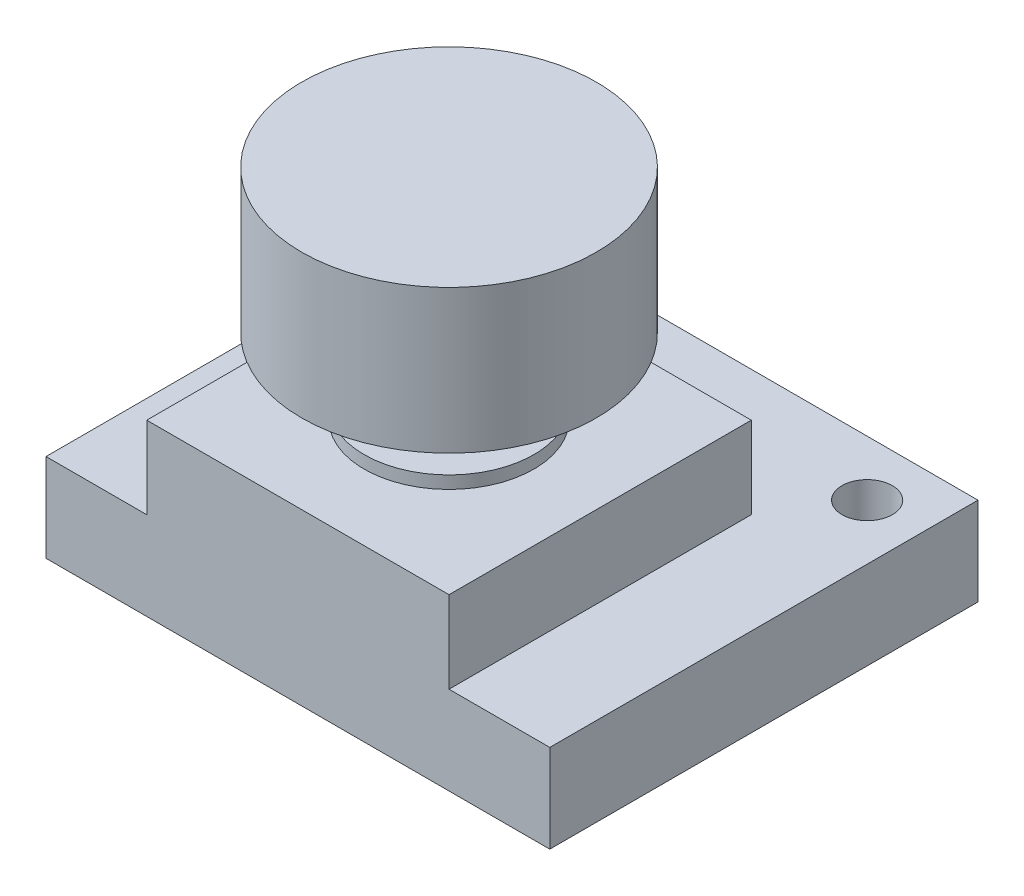
ISO-10303-21;
HEADER;
FILE_DESCRIPTION(('STEP AP214'),'2;1');
FILE_NAME('part.step','',(''),(''),'','','');
FILE_SCHEMA(('AUTOMOTIVE_DESIGN { 1 0 10303 214 1 1 1 1 }'));
ENDSEC;
DATA;
#1=APPLICATION_CONTEXT('core data for automotive mechanical design processes');
#2=APPLICATION_PROTOCOL_DEFINITION('international standard','automotive_design',2000,#1);
#3=PRODUCT_CONTEXT('',#1,'mechanical');
#4=PRODUCT('Part','Part','',(#3));
#5=PRODUCT_RELATED_PRODUCT_CATEGORY('part','',(#4));
#6=PRODUCT_DEFINITION_FORMATION('','',#4);
#7=PRODUCT_DEFINITION_CONTEXT('part definition',#1,'design');
#8=PRODUCT_DEFINITION('design','',#6,#7);
#9=PRODUCT_DEFINITION_SHAPE('','',#8);
#10=(LENGTH_UNIT() NAMED_UNIT(*) SI_UNIT(.MILLI.,.METRE.));
#11=(NAMED_UNIT(*) PLANE_ANGLE_UNIT() SI_UNIT($,.RADIAN.));
#12=(NAMED_UNIT(*) SI_UNIT($,.STERADIAN.) SOLID_ANGLE_UNIT());
#13=UNCERTAINTY_MEASURE_WITH_UNIT(LENGTH_MEASURE(1.E-05),#10,'distance_accuracy_value','');
#14=(GEOMETRIC_REPRESENTATION_CONTEXT(3) GLOBAL_UNCERTAINTY_ASSIGNED_CONTEXT((#13)) GLOBAL_UNIT_ASSIGNED_CONTEXT((#10,
#11,#12)) REPRESENTATION_CONTEXT('',''));
#15=CARTESIAN_POINT('',(0.,0.,0.));
#16=DIRECTION('',(0.,0.,1.));
#17=DIRECTION('',(1.,0.,0.));
#18=AXIS2_PLACEMENT_3D('',#15,#16,#17);
#19=CARTESIAN_POINT('',(-1.9,7.25,0.));
#20=DIRECTION('',(-1.,0.,0.));
#21=DIRECTION('',(0.,0.,1.));
#22=AXIS2_PLACEMENT_3D('',#19,#20,#21);
#23=PLANE('',#22);
#24=DIRECTION('',(0.,-1.,0.));
#25=VECTOR('',#24,1.);
#26=CARTESIAN_POINT('',(-1.9,7.25,1.9));
#27=LINE('',#26,#25);
#28=CARTESIAN_POINT('',(-1.9,6.25,1.9));
#29=VERTEX_POINT('',#28);
#30=CARTESIAN_POINT('',(-1.9,5.25,1.9));
#31=VERTEX_POINT('',#30);
#32=EDGE_CURVE('E170',#29,#31,#27,.T.);
#33=ORIENTED_EDGE('',*,*,#32,.F.);
#34=DIRECTION('',(0.,0.,-1.));
#35=VECTOR('',#34,1.);
#36=CARTESIAN_POINT('',(-1.9,6.25,0.));
#37=LINE('',#36,#35);
#38=CARTESIAN_POINT('',(-1.9,6.25,-1.9));
#39=VERTEX_POINT('',#38);
#40=EDGE_CURVE('E169',#29,#39,#37,.T.);
#41=ORIENTED_EDGE('',*,*,#40,.T.);
#42=DIRECTION('',(0.,-1.,0.));
#43=VECTOR('',#42,1.);
#44=CARTESIAN_POINT('',(-1.9,7.25,-1.9));
#45=LINE('',#44,#43);
#46=CARTESIAN_POINT('',(-1.9,5.25,-1.9));
#47=VERTEX_POINT('',#46);
#48=EDGE_CURVE('E157',#39,#47,#45,.T.);
#49=ORIENTED_EDGE('',*,*,#48,.T.);
#50=DIRECTION('',(0.,0.,-1.));
#51=VECTOR('',#50,1.);
#52=CARTESIAN_POINT('',(-1.9,5.25,0.));
#53=LINE('',#52,#51);
#54=EDGE_CURVE('E227',#31,#47,#53,.T.);
#55=ORIENTED_EDGE('',*,*,#54,.F.);
#56=EDGE_LOOP('',(#33,#41,#49,#55));
#57=FACE_BOUND('',#56,.T.);
#58=ADVANCED_FACE('F44',(#57),#23,.T.);
#59=CARTESIAN_POINT('',(0.,7.25,1.9));
#60=DIRECTION('',(0.,0.,1.));
#61=DIRECTION('',(1.,0.,0.));
#62=AXIS2_PLACEMENT_3D('',#59,#60,#61);
#63=PLANE('',#62);
#64=DIRECTION('',(0.,-1.,0.));
#65=VECTOR('',#64,1.);
#66=CARTESIAN_POINT('',(1.9,7.25,1.9));
#67=LINE('',#66,#65);
#68=CARTESIAN_POINT('',(1.9,6.25,1.9));
#69=VERTEX_POINT('',#68);
#70=CARTESIAN_POINT('',(1.9,5.25,1.9));
#71=VERTEX_POINT('',#70);
#72=EDGE_CURVE('E246',#69,#71,#67,.T.);
#73=ORIENTED_EDGE('',*,*,#72,.F.);
#74=DIRECTION('',(-1.,0.,0.));
#75=VECTOR('',#74,1.);
#76=CARTESIAN_POINT('',(0.,6.25,1.9));
#77=LINE('',#76,#75);
#78=EDGE_CURVE('E59',#69,#29,#77,.T.);
#79=ORIENTED_EDGE('',*,*,#78,.T.);
#80=ORIENTED_EDGE('',*,*,#32,.T.);
#81=DIRECTION('',(-1.,0.,0.));
#82=VECTOR('',#81,1.);
#83=CARTESIAN_POINT('',(0.,5.25,1.9));
#84=LINE('',#83,#82);
#85=EDGE_CURVE('E229',#71,#31,#84,.T.);
#86=ORIENTED_EDGE('',*,*,#85,.F.);
#87=EDGE_LOOP('',(#73,#79,#80,#86));
#88=FACE_BOUND('',#87,.T.);
#89=ADVANCED_FACE('F324',(#88),#63,.T.);
#90=CARTESIAN_POINT('',(1.9,7.25,0.));
#91=DIRECTION('',(-1.,0.,0.));
#92=DIRECTION('',(0.,0.,1.));
#93=AXIS2_PLACEMENT_3D('',#90,#91,#92);
#94=PLANE('',#93);
#95=DIRECTION('',(0.,0.,-1.));
#96=VECTOR('',#95,1.);
#97=CARTESIAN_POINT('',(1.9,6.25,0.));
#98=LINE('',#97,#96);
#99=CARTESIAN_POINT('',(1.9,6.25,-1.9));
#100=VERTEX_POINT('',#99);
#101=EDGE_CURVE('E67',#69,#100,#98,.T.);
#102=ORIENTED_EDGE('',*,*,#101,.F.);
#103=ORIENTED_EDGE('',*,*,#72,.T.);
#104=DIRECTION('',(0.,0.,-1.));
#105=VECTOR('',#104,1.);
#106=CARTESIAN_POINT('',(1.9,5.25,0.));
#107=LINE('',#106,#105);
#108=CARTESIAN_POINT('',(1.9,5.25,-1.9));
#109=VERTEX_POINT('',#108);
#110=EDGE_CURVE('E232',#71,#109,#107,.T.);
#111=ORIENTED_EDGE('',*,*,#110,.T.);
#112=DIRECTION('',(0.,-1.,0.));
#113=VECTOR('',#112,1.);
#114=CARTESIAN_POINT('',(1.9,7.25,-1.9));
#115=LINE('',#114,#113);
#116=EDGE_CURVE('E165',#100,#109,#115,.T.);
#117=ORIENTED_EDGE('',*,*,#116,.F.);
#118=EDGE_LOOP('',(#102,#103,#111,#117));
#119=FACE_BOUND('',#118,.T.);
#120=ADVANCED_FACE('F330',(#119),#94,.F.);
#121=CARTESIAN_POINT('',(0.,7.25,-1.9));
#122=DIRECTION('',(0.,0.,1.));
#123=DIRECTION('',(1.,0.,0.));
#124=AXIS2_PLACEMENT_3D('',#121,#122,#123);
#125=PLANE('',#124);
#126=DIRECTION('',(-1.,0.,0.));
#127=VECTOR('',#126,1.);
#128=CARTESIAN_POINT('',(0.,6.25,-1.9));
#129=LINE('',#128,#127);
#130=EDGE_CURVE('E11',#100,#39,#129,.T.);
#131=ORIENTED_EDGE('',*,*,#130,.F.);
#132=ORIENTED_EDGE('',*,*,#116,.T.);
#133=DIRECTION('',(-1.,0.,0.));
#134=VECTOR('',#133,1.);
#135=CARTESIAN_POINT('',(0.,5.25,-1.9));
#136=LINE('',#135,#134);
#137=EDGE_CURVE('E161',#109,#47,#136,.T.);
#138=ORIENTED_EDGE('',*,*,#137,.T.);
#139=ORIENTED_EDGE('',*,*,#48,.F.);
#140=EDGE_LOOP('',(#131,#132,#138,#139));
#141=FACE_BOUND('',#140,.T.);
#142=ADVANCED_FACE('F159',(#141),#125,.F.);
#143=CARTESIAN_POINT('',(0.,7.25,1.5));
#144=DIRECTION('',(0.,0.,-1.));
#145=DIRECTION('',(-1.,0.,0.));
#146=AXIS2_PLACEMENT_3D('',#143,#144,#145);
#147=PLANE('',#146);
#148=DIRECTION('',(1.,0.,0.));
#149=VECTOR('',#148,1.);
#150=CARTESIAN_POINT('',(0.,5.25,1.5));
#151=LINE('',#150,#149);
#152=CARTESIAN_POINT('',(-1.5,5.25,1.5));
#153=VERTEX_POINT('',#152);
#154=CARTESIAN_POINT('',(1.5,5.25,1.5));
#155=VERTEX_POINT('',#154);
#156=EDGE_CURVE('E238',#153,#155,#151,.T.);
#157=ORIENTED_EDGE('',*,*,#156,.F.);
#158=DIRECTION('',(0.,-1.,0.));
#159=VECTOR('',#158,1.);
#160=CARTESIAN_POINT('',(-1.5,7.25,1.5));
#161=LINE('',#160,#159);
#162=CARTESIAN_POINT('',(-1.5,3.75,1.5));
#163=VERTEX_POINT('',#162);
#164=EDGE_CURVE('E249',#153,#163,#161,.T.);
#165=ORIENTED_EDGE('',*,*,#164,.T.);
#166=DIRECTION('',(1.,0.,0.));
#167=VECTOR('',#166,1.);
#168=CARTESIAN_POINT('',(0.,3.75,1.5));
#169=LINE('',#168,#167);
#170=CARTESIAN_POINT('',(1.5,3.75,1.5));
#171=VERTEX_POINT('',#170);
#172=EDGE_CURVE('E263',#163,#171,#169,.T.);
#173=ORIENTED_EDGE('',*,*,#172,.T.);
#174=DIRECTION('',(0.,-1.,0.));
#175=VECTOR('',#174,1.);
#176=CARTESIAN_POINT('',(1.5,7.25,1.5));
#177=LINE('',#176,#175);
#178=EDGE_CURVE('E255',#155,#171,#177,.T.);
#179=ORIENTED_EDGE('',*,*,#178,.F.);
#180=EDGE_LOOP('',(#157,#165,#173,#179));
#181=FACE_BOUND('',#180,.T.);
#182=ADVANCED_FACE('F340',(#181),#147,.F.);
#183=CARTESIAN_POINT('',(1.5,7.25,0.));
#184=DIRECTION('',(-1.,0.,0.));
#185=DIRECTION('',(0.,0.,1.));
#186=AXIS2_PLACEMENT_3D('',#183,#184,#185);
#187=PLANE('',#186);
#188=DIRECTION('',(0.,0.,-1.));
#189=VECTOR('',#188,1.);
#190=CARTESIAN_POINT('',(1.5,5.25,0.));
#191=LINE('',#190,#189);
#192=CARTESIAN_POINT('',(1.5,5.25,-1.5));
#193=VERTEX_POINT('',#192);
#194=EDGE_CURVE('E236',#155,#193,#191,.T.);
#195=ORIENTED_EDGE('',*,*,#194,.F.);
#196=ORIENTED_EDGE('',*,*,#178,.T.);
#197=DIRECTION('',(0.,0.,-1.));
#198=VECTOR('',#197,1.);
#199=CARTESIAN_POINT('',(1.5,3.75,0.));
#200=LINE('',#199,#198);
#201=CARTESIAN_POINT('',(1.5,3.75,-1.5));
#202=VERTEX_POINT('',#201);
#203=EDGE_CURVE('E260',#171,#202,#200,.T.);
#204=ORIENTED_EDGE('',*,*,#203,.T.);
#205=DIRECTION('',(0.,-1.,0.));
#206=VECTOR('',#205,1.);
#207=CARTESIAN_POINT('',(1.5,7.25,-1.5));
#208=LINE('',#207,#206);
#209=EDGE_CURVE('E253',#193,#202,#208,.T.);
#210=ORIENTED_EDGE('',*,*,#209,.F.);
#211=EDGE_LOOP('',(#195,#196,#204,#210));
#212=FACE_BOUND('',#211,.T.);
#213=ADVANCED_FACE('F336',(#212),#187,.F.);
#214=CARTESIAN_POINT('',(0.,7.25,-1.5));
#215=DIRECTION('',(0.,0.,-1.));
#216=DIRECTION('',(-1.,0.,0.));
#217=AXIS2_PLACEMENT_3D('',#214,#215,#216);
#218=PLANE('',#217);
#219=DIRECTION('',(0.,-1.,0.));
#220=VECTOR('',#219,1.);
#221=CARTESIAN_POINT('',(-1.5,7.25,-1.5));
#222=LINE('',#221,#220);
#223=CARTESIAN_POINT('',(-1.5,5.25,-1.5));
#224=VERTEX_POINT('',#223);
#225=CARTESIAN_POINT('',(-1.5,3.75,-1.5));
#226=VERTEX_POINT('',#225);
#227=EDGE_CURVE('E251',#224,#226,#222,.T.);
#228=ORIENTED_EDGE('',*,*,#227,.F.);
#229=DIRECTION('',(1.,0.,0.));
#230=VECTOR('',#229,1.);
#231=CARTESIAN_POINT('',(0.,5.25,-1.5));
#232=LINE('',#231,#230);
#233=EDGE_CURVE('E166',#224,#193,#232,.T.);
#234=ORIENTED_EDGE('',*,*,#233,.T.);
#235=ORIENTED_EDGE('',*,*,#209,.T.);
#236=DIRECTION('',(1.,0.,0.));
#237=VECTOR('',#236,1.);
#238=CARTESIAN_POINT('',(0.,3.75,-1.5));
#239=LINE('',#238,#237);
#240=EDGE_CURVE('E269',#226,#202,#239,.T.);
#241=ORIENTED_EDGE('',*,*,#240,.F.);
#242=EDGE_LOOP('',(#228,#234,#235,#241));
#243=FACE_BOUND('',#242,.T.);
#244=ADVANCED_FACE('F318',(#243),#218,.T.);
#245=CARTESIAN_POINT('',(-1.5,7.25,0.));
#246=DIRECTION('',(-1.,0.,0.));
#247=DIRECTION('',(0.,0.,1.));
#248=AXIS2_PLACEMENT_3D('',#245,#246,#247);
#249=PLANE('',#248);
#250=ORIENTED_EDGE('',*,*,#164,.F.);
#251=DIRECTION('',(0.,0.,-1.));
#252=VECTOR('',#251,1.);
#253=CARTESIAN_POINT('',(-1.5,5.25,0.));
#254=LINE('',#253,#252);
#255=EDGE_CURVE('E240',#153,#224,#254,.T.);
#256=ORIENTED_EDGE('',*,*,#255,.T.);
#257=ORIENTED_EDGE('',*,*,#227,.T.);
#258=DIRECTION('',(0.,0.,-1.));
#259=VECTOR('',#258,1.);
#260=CARTESIAN_POINT('',(-1.5,3.75,0.));
#261=LINE('',#260,#259);
#262=EDGE_CURVE('E266',#163,#226,#261,.T.);
#263=ORIENTED_EDGE('',*,*,#262,.F.);
#264=EDGE_LOOP('',(#250,#256,#257,#263));
#265=FACE_BOUND('',#264,.T.);
#266=ADVANCED_FACE('F308',(#265),#249,.T.);
#267=CARTESIAN_POINT('',(0.,3.25,0.));
#268=DIRECTION('',(0.,-1.,0.));
#269=DIRECTION('',(0.,0.,-1.));
#270=AXIS2_PLACEMENT_3D('',#267,#268,#269);
#271=PLANE('',#270);
#272=DIRECTION('',(0.,0.,-1.));
#273=VECTOR('',#272,1.);
#274=CARTESIAN_POINT('',(6.,3.25,6.));
#275=LINE('',#274,#273);
#276=CARTESIAN_POINT('',(6.,3.25,6.));
#277=VERTEX_POINT('',#276);
#278=CARTESIAN_POINT('',(6.,3.25,-6.));
#279=VERTEX_POINT('',#278);
#280=EDGE_CURVE('E273',#277,#279,#275,.T.);
#281=ORIENTED_EDGE('',*,*,#280,.T.);
#282=DIRECTION('',(-1.,0.,0.));
#283=VECTOR('',#282,1.);
#284=CARTESIAN_POINT('',(-6.,3.25,-6.));
#285=LINE('',#284,#283);
#286=CARTESIAN_POINT('',(-6.,3.25,-6.));
#287=VERTEX_POINT('',#286);
#288=EDGE_CURVE('E276',#279,#287,#285,.T.);
#289=ORIENTED_EDGE('',*,*,#288,.T.);
#290=DIRECTION('',(0.,0.,1.));
#291=VECTOR('',#290,1.);
#292=CARTESIAN_POINT('',(-6.,3.25,6.));
#293=LINE('',#292,#291);
#294=CARTESIAN_POINT('',(-6.,3.25,6.));
#295=VERTEX_POINT('',#294);
#296=EDGE_CURVE('E279',#287,#295,#293,.T.);
#297=ORIENTED_EDGE('',*,*,#296,.T.);
#298=DIRECTION('',(1.,0.,0.));
#299=VECTOR('',#298,1.);
#300=CARTESIAN_POINT('',(-6.,3.25,6.));
#301=LINE('',#300,#299);
#302=EDGE_CURVE('E281',#295,#277,#301,.T.);
#303=ORIENTED_EDGE('',*,*,#302,.T.);
#304=EDGE_LOOP('',(#281,#289,#297,#303));
#305=FACE_BOUND('',#304,.T.);
#306=CARTESIAN_POINT('',(0.,3.25,0.));
#307=DIRECTION('',(0.,-1.,0.));
#308=DIRECTION('',(0.,0.,-1.));
#309=AXIS2_PLACEMENT_3D('',#306,#307,#308);
#310=CIRCLE('',#309,3.37);
#311=CARTESIAN_POINT('',(0.,3.25,-3.37));
#312=VERTEX_POINT('',#311);
#313=EDGE_CURVE('E52',#312,#312,#310,.F.);
#314=ORIENTED_EDGE('',*,*,#313,.F.);
#315=EDGE_LOOP('',(#314));
#316=FACE_BOUND('',#315,.T.);
#317=ADVANCED_FACE('F306',(#305,#316),#271,.F.);
#318=CARTESIAN_POINT('',(6.,3.25,6.));
#319=DIRECTION('',(-1.,0.,0.));
#320=DIRECTION('',(0.,0.,1.));
#321=AXIS2_PLACEMENT_3D('',#318,#319,#320);
#322=PLANE('',#321);
#323=DIRECTION('',(0.,0.,-1.));
#324=VECTOR('',#323,1.);
#325=CARTESIAN_POINT('',(6.,0.,6.));
#326=LINE('',#325,#324);
#327=CARTESIAN_POINT('',(6.,0.,6.));
#328=VERTEX_POINT('',#327);
#329=CARTESIAN_POINT('',(6.,0.,-6.));
#330=VERTEX_POINT('',#329);
#331=EDGE_CURVE('E272',#328,#330,#326,.T.);
#332=ORIENTED_EDGE('',*,*,#331,.T.);
#333=DIRECTION('',(0.,-1.,0.));
#334=VECTOR('',#333,1.);
#335=CARTESIAN_POINT('',(6.,3.25,-6.));
#336=LINE('',#335,#334);
#337=EDGE_CURVE('E299',#279,#330,#336,.T.);
#338=ORIENTED_EDGE('',*,*,#337,.F.);
#339=ORIENTED_EDGE('',*,*,#280,.F.);
#340=DIRECTION('',(0.,-1.,0.));
#341=VECTOR('',#340,1.);
#342=CARTESIAN_POINT('',(6.,3.25,6.));
#343=LINE('',#342,#341);
#344=EDGE_CURVE('E283',#277,#328,#343,.T.);
#345=ORIENTED_EDGE('',*,*,#344,.T.);
#346=EDGE_LOOP('',(#332,#338,#339,#345));
#347=FACE_BOUND('',#346,.T.);
#348=ADVANCED_FACE('F46',(#347),#322,.F.);
#349=CARTESIAN_POINT('',(-6.,3.25,-6.));
#350=DIRECTION('',(0.,0.,1.));
#351=DIRECTION('',(1.,0.,0.));
#352=AXIS2_PLACEMENT_3D('',#349,#350,#351);
#353=PLANE('',#352);
#354=DIRECTION('',(-1.,0.,0.));
#355=VECTOR('',#354,1.);
#356=CARTESIAN_POINT('',(-6.,0.,-6.));
#357=LINE('',#356,#355);
#358=CARTESIAN_POINT('',(-6.,0.,-6.));
#359=VERTEX_POINT('',#358);
#360=EDGE_CURVE('E286',#330,#359,#357,.T.);
#361=ORIENTED_EDGE('',*,*,#360,.T.);
#362=DIRECTION('',(0.,-1.,0.));
#363=VECTOR('',#362,1.);
#364=CARTESIAN_POINT('',(-6.,3.25,-6.));
#365=LINE('',#364,#363);
#366=EDGE_CURVE('E296',#287,#359,#365,.T.);
#367=ORIENTED_EDGE('',*,*,#366,.F.);
#368=ORIENTED_EDGE('',*,*,#288,.F.);
#369=ORIENTED_EDGE('',*,*,#337,.T.);
#370=EDGE_LOOP('',(#361,#367,#368,#369));
#371=FACE_BOUND('',#370,.T.);
#372=ADVANCED_FACE('F315',(#371),#353,.F.);
#373=CARTESIAN_POINT('',(-6.,3.25,6.));
#374=DIRECTION('',(1.,0.,0.));
#375=DIRECTION('',(0.,0.,-1.));
#376=AXIS2_PLACEMENT_3D('',#373,#374,#375);
#377=PLANE('',#376);
#378=DIRECTION('',(0.,0.,1.));
#379=VECTOR('',#378,1.);
#380=CARTESIAN_POINT('',(-6.,0.,6.));
#381=LINE('',#380,#379);
#382=CARTESIAN_POINT('',(-6.,0.,6.));
#383=VERTEX_POINT('',#382);
#384=EDGE_CURVE('E277',#359,#383,#381,.T.);
#385=ORIENTED_EDGE('',*,*,#384,.T.);
#386=DIRECTION('',(0.,-1.,0.));
#387=VECTOR('',#386,1.);
#388=CARTESIAN_POINT('',(-6.,3.25,6.));
#389=LINE('',#388,#387);
#390=EDGE_CURVE('E293',#295,#383,#389,.T.);
#391=ORIENTED_EDGE('',*,*,#390,.F.);
#392=ORIENTED_EDGE('',*,*,#296,.F.);
#393=ORIENTED_EDGE('',*,*,#366,.T.);
#394=EDGE_LOOP('',(#385,#391,#392,#393));
#395=FACE_BOUND('',#394,.T.);
#396=ADVANCED_FACE('F354',(#395),#377,.F.);
#397=CARTESIAN_POINT('',(-6.,3.25,6.));
#398=DIRECTION('',(0.,0.,-1.));
#399=DIRECTION('',(-1.,0.,0.));
#400=AXIS2_PLACEMENT_3D('',#397,#398,#399);
#401=PLANE('',#400);
#402=ORIENTED_EDGE('',*,*,#390,.T.);
#403=DIRECTION('',(-1.,0.,0.));
#404=VECTOR('',#403,1.);
#405=CARTESIAN_POINT('',(-9.99999999999999,0.,6.));
#406=LINE('',#405,#404);
#407=CARTESIAN_POINT('',(-9.99999999999999,0.,6.));
#408=VERTEX_POINT('',#407);
#409=EDGE_CURVE('E213',#383,#408,#406,.T.);
#410=ORIENTED_EDGE('',*,*,#409,.T.);
#411=DIRECTION('',(0.,1.,0.));
#412=VECTOR('',#411,1.);
#413=CARTESIAN_POINT('',(-9.99999999999999,-3.5,6.));
#414=LINE('',#413,#412);
#415=CARTESIAN_POINT('',(-9.99999999999999,-3.5,6.));
#416=VERTEX_POINT('',#415);
#417=EDGE_CURVE('E206',#416,#408,#414,.T.);
#418=ORIENTED_EDGE('',*,*,#417,.F.);
#419=DIRECTION('',(-1.,0.,0.));
#420=VECTOR('',#419,1.);
#421=CARTESIAN_POINT('',(-9.99999999999999,-3.5,6.));
#422=LINE('',#421,#420);
#423=CARTESIAN_POINT('',(10.,-3.5,6.));
#424=VERTEX_POINT('',#423);
#425=EDGE_CURVE('E204',#424,#416,#422,.T.);
#426=ORIENTED_EDGE('',*,*,#425,.F.);
#427=DIRECTION('',(0.,1.,0.));
#428=VECTOR('',#427,1.);
#429=CARTESIAN_POINT('',(10.,-3.5,6.));
#430=LINE('',#429,#428);
#431=CARTESIAN_POINT('',(10.,0.,6.));
#432=VERTEX_POINT('',#431);
#433=EDGE_CURVE('E218',#424,#432,#430,.T.);
#434=ORIENTED_EDGE('',*,*,#433,.T.);
#435=EDGE_CURVE('E200',#432,#328,#406,.T.);
#436=ORIENTED_EDGE('',*,*,#435,.T.);
#437=ORIENTED_EDGE('',*,*,#344,.F.);
#438=ORIENTED_EDGE('',*,*,#302,.F.);
#439=EDGE_LOOP('',(#402,#410,#418,#426,#434,#436,#437,#438));
#440=FACE_BOUND('',#439,.T.);
#441=ADVANCED_FACE('F349',(#440),#401,.F.);
#442=CARTESIAN_POINT('',(0.,3.75,0.));
#443=DIRECTION('',(0.,-1.,0.));
#444=DIRECTION('',(0.,0.,-1.));
#445=AXIS2_PLACEMENT_3D('',#442,#443,#444);
#446=CYLINDRICAL_SURFACE('',#445,3.37);
#447=CARTESIAN_POINT('',(0.,3.75,0.));
#448=DIRECTION('',(0.,1.,0.));
#449=DIRECTION('',(0.,0.,1.));
#450=AXIS2_PLACEMENT_3D('',#447,#448,#449);
#451=CIRCLE('',#450,3.37);
#452=CARTESIAN_POINT('',(0.,3.75,3.37));
#453=VERTEX_POINT('',#452);
#454=EDGE_CURVE('E257',#453,#453,#451,.T.);
#455=ORIENTED_EDGE('',*,*,#454,.F.);
#456=EDGE_LOOP('',(#455));
#457=FACE_BOUND('',#456,.T.);
#458=ORIENTED_EDGE('',*,*,#313,.T.);
#459=EDGE_LOOP('',(#458));
#460=FACE_BOUND('',#459,.T.);
#461=ADVANCED_FACE('F304',(#457,#460),#446,.T.);
#462=CARTESIAN_POINT('',(0.,3.75,0.));
#463=DIRECTION('',(0.,1.,0.));
#464=DIRECTION('',(0.,0.,1.));
#465=AXIS2_PLACEMENT_3D('',#462,#463,#464);
#466=PLANE('',#465);
#467=ORIENTED_EDGE('',*,*,#454,.T.);
#468=EDGE_LOOP('',(#467));
#469=FACE_BOUND('',#468,.T.);
#470=ORIENTED_EDGE('',*,*,#203,.F.);
#471=ORIENTED_EDGE('',*,*,#172,.F.);
#472=ORIENTED_EDGE('',*,*,#262,.T.);
#473=ORIENTED_EDGE('',*,*,#240,.T.);
#474=EDGE_LOOP('',(#470,#471,#472,#473));
#475=FACE_BOUND('',#474,.T.);
#476=ADVANCED_FACE('F345',(#469,#475),#466,.T.);
#477=CARTESIAN_POINT('',(0.,5.25,0.));
#478=DIRECTION('',(0.,1.,0.));
#479=DIRECTION('',(0.,0.,1.));
#480=AXIS2_PLACEMENT_3D('',#477,#478,#479);
#481=PLANE('',#480);
#482=ORIENTED_EDGE('',*,*,#54,.T.);
#483=ORIENTED_EDGE('',*,*,#137,.F.);
#484=ORIENTED_EDGE('',*,*,#110,.F.);
#485=ORIENTED_EDGE('',*,*,#85,.T.);
#486=EDGE_LOOP('',(#482,#483,#484,#485));
#487=FACE_BOUND('',#486,.T.);
#488=ORIENTED_EDGE('',*,*,#194,.T.);
#489=ORIENTED_EDGE('',*,*,#233,.F.);
#490=ORIENTED_EDGE('',*,*,#255,.F.);
#491=ORIENTED_EDGE('',*,*,#156,.T.);
#492=EDGE_LOOP('',(#488,#489,#490,#491));
#493=FACE_BOUND('',#492,.T.);
#494=ADVANCED_FACE('F347',(#487,#493),#481,.F.);
#495=CARTESIAN_POINT('',(0.,-3.5,0.));
#496=DIRECTION('',(0.,-1.,0.));
#497=DIRECTION('',(0.,0.,-1.));
#498=AXIS2_PLACEMENT_3D('',#495,#496,#497);
#499=PLANE('',#498);
#500=CARTESIAN_POINT('',(-7.79999999999999,-3.5,-8.8));
#501=DIRECTION('',(0.,-1.,0.));
#502=DIRECTION('',(0.,0.,-1.));
#503=AXIS2_PLACEMENT_3D('',#500,#501,#502);
#504=CIRCLE('',#503,1.);
#505=CARTESIAN_POINT('',(-7.79999999999999,-3.5,-9.8));
#506=VERTEX_POINT('',#505);
#507=EDGE_CURVE('E190',#506,#506,#504,.T.);
#508=ORIENTED_EDGE('',*,*,#507,.F.);
#509=EDGE_LOOP('',(#508));
#510=FACE_BOUND('',#509,.T.);
#511=DIRECTION('',(0.,0.,-1.));
#512=VECTOR('',#511,1.);
#513=CARTESIAN_POINT('',(-9.99999999999999,-3.5,6.));
#514=LINE('',#513,#512);
#515=CARTESIAN_POINT('',(-9.99999999999999,-3.5,-11.));
#516=VERTEX_POINT('',#515);
#517=EDGE_CURVE('E196',#416,#516,#514,.T.);
#518=ORIENTED_EDGE('',*,*,#517,.T.);
#519=DIRECTION('',(1.,0.,0.));
#520=VECTOR('',#519,1.);
#521=CARTESIAN_POINT('',(-9.99999999999999,-3.5,-11.));
#522=LINE('',#521,#520);
#523=CARTESIAN_POINT('',(10.,-3.5,-11.));
#524=VERTEX_POINT('',#523);
#525=EDGE_CURVE('E199',#516,#524,#522,.T.);
#526=ORIENTED_EDGE('',*,*,#525,.T.);
#527=DIRECTION('',(0.,0.,1.));
#528=VECTOR('',#527,1.);
#529=CARTESIAN_POINT('',(10.,-3.5,6.));
#530=LINE('',#529,#528);
#531=EDGE_CURVE('E202',#524,#424,#530,.T.);
#532=ORIENTED_EDGE('',*,*,#531,.T.);
#533=ORIENTED_EDGE('',*,*,#425,.T.);
#534=EDGE_LOOP('',(#518,#526,#532,#533));
#535=FACE_BOUND('',#534,.T.);
#536=CARTESIAN_POINT('',(7.79999999999999,-3.5,-8.8));
#537=DIRECTION('',(0.,-1.,0.));
#538=DIRECTION('',(0.,0.,1.));
#539=AXIS2_PLACEMENT_3D('',#536,#537,#538);
#540=CIRCLE('',#539,1.);
#541=CARTESIAN_POINT('',(7.79999999999999,-3.5,-7.8));
#542=VERTEX_POINT('',#541);
#543=EDGE_CURVE('E184',#542,#542,#540,.T.);
#544=ORIENTED_EDGE('',*,*,#543,.F.);
#545=EDGE_LOOP('',(#544));
#546=FACE_BOUND('',#545,.T.);
#547=ADVANCED_FACE('F370',(#510,#535,#546),#499,.T.);
#548=CARTESIAN_POINT('',(0.,0.,0.));
#549=DIRECTION('',(0.,-1.,0.));
#550=DIRECTION('',(0.,0.,-1.));
#551=AXIS2_PLACEMENT_3D('',#548,#549,#550);
#552=PLANE('',#551);
#553=ORIENTED_EDGE('',*,*,#331,.F.);
#554=ORIENTED_EDGE('',*,*,#435,.F.);
#555=DIRECTION('',(0.,0.,1.));
#556=VECTOR('',#555,1.);
#557=CARTESIAN_POINT('',(10.,0.,6.));
#558=LINE('',#557,#556);
#559=CARTESIAN_POINT('',(10.,0.,-11.));
#560=VERTEX_POINT('',#559);
#561=EDGE_CURVE('E211',#560,#432,#558,.T.);
#562=ORIENTED_EDGE('',*,*,#561,.F.);
#563=DIRECTION('',(1.,0.,0.));
#564=VECTOR('',#563,1.);
#565=CARTESIAN_POINT('',(-9.99999999999999,0.,-11.));
#566=LINE('',#565,#564);
#567=CARTESIAN_POINT('',(-9.99999999999999,0.,-11.));
#568=VERTEX_POINT('',#567);
#569=EDGE_CURVE('E209',#568,#560,#566,.T.);
#570=ORIENTED_EDGE('',*,*,#569,.F.);
#571=DIRECTION('',(0.,0.,-1.));
#572=VECTOR('',#571,1.);
#573=CARTESIAN_POINT('',(-9.99999999999999,0.,6.));
#574=LINE('',#573,#572);
#575=EDGE_CURVE('E193',#408,#568,#574,.T.);
#576=ORIENTED_EDGE('',*,*,#575,.F.);
#577=ORIENTED_EDGE('',*,*,#409,.F.);
#578=ORIENTED_EDGE('',*,*,#384,.F.);
#579=ORIENTED_EDGE('',*,*,#360,.F.);
#580=EDGE_LOOP('',(#553,#554,#562,#570,#576,#577,#578,#579));
#581=FACE_BOUND('',#580,.T.);
#582=CARTESIAN_POINT('',(-7.79999999999999,0.,-8.8));
#583=DIRECTION('',(0.,-1.,0.));
#584=DIRECTION('',(0.,0.,-1.));
#585=AXIS2_PLACEMENT_3D('',#582,#583,#584);
#586=CIRCLE('',#585,1.);
#587=CARTESIAN_POINT('',(-7.79999999999999,0.,-9.8));
#588=VERTEX_POINT('',#587);
#589=EDGE_CURVE('E187',#588,#588,#586,.T.);
#590=ORIENTED_EDGE('',*,*,#589,.T.);
#591=EDGE_LOOP('',(#590));
#592=FACE_BOUND('',#591,.T.);
#593=CARTESIAN_POINT('',(7.79999999999999,0.,-8.8));
#594=DIRECTION('',(0.,-1.,0.));
#595=DIRECTION('',(0.,0.,1.));
#596=AXIS2_PLACEMENT_3D('',#593,#594,#595);
#597=CIRCLE('',#596,1.);
#598=CARTESIAN_POINT('',(7.79999999999999,0.,-7.8));
#599=VERTEX_POINT('',#598);
#600=EDGE_CURVE('E172',#599,#599,#597,.T.);
#601=ORIENTED_EDGE('',*,*,#600,.T.);
#602=EDGE_LOOP('',(#601));
#603=FACE_BOUND('',#602,.T.);
#604=ADVANCED_FACE('F376',(#581,#592,#603),#552,.F.);
#605=CARTESIAN_POINT('',(-9.99999999999999,-3.5,6.));
#606=DIRECTION('',(1.,0.,0.));
#607=DIRECTION('',(0.,0.,-1.));
#608=AXIS2_PLACEMENT_3D('',#605,#606,#607);
#609=PLANE('',#608);
#610=ORIENTED_EDGE('',*,*,#575,.T.);
#611=DIRECTION('',(0.,1.,0.));
#612=VECTOR('',#611,1.);
#613=CARTESIAN_POINT('',(-9.99999999999999,-3.5,-11.));
#614=LINE('',#613,#612);
#615=EDGE_CURVE('E224',#516,#568,#614,.T.);
#616=ORIENTED_EDGE('',*,*,#615,.F.);
#617=ORIENTED_EDGE('',*,*,#517,.F.);
#618=ORIENTED_EDGE('',*,*,#417,.T.);
#619=EDGE_LOOP('',(#610,#616,#617,#618));
#620=FACE_BOUND('',#619,.T.);
#621=ADVANCED_FACE('F381',(#620),#609,.F.);
#622=CARTESIAN_POINT('',(-9.99999999999999,-3.5,-11.));
#623=DIRECTION('',(0.,0.,1.));
#624=DIRECTION('',(1.,0.,0.));
#625=AXIS2_PLACEMENT_3D('',#622,#623,#624);
#626=PLANE('',#625);
#627=ORIENTED_EDGE('',*,*,#569,.T.);
#628=DIRECTION('',(0.,1.,0.));
#629=VECTOR('',#628,1.);
#630=CARTESIAN_POINT('',(10.,-3.5,-11.));
#631=LINE('',#630,#629);
#632=EDGE_CURVE('E221',#524,#560,#631,.T.);
#633=ORIENTED_EDGE('',*,*,#632,.F.);
#634=ORIENTED_EDGE('',*,*,#525,.F.);
#635=ORIENTED_EDGE('',*,*,#615,.T.);
#636=EDGE_LOOP('',(#627,#633,#634,#635));
#637=FACE_BOUND('',#636,.T.);
#638=ADVANCED_FACE('F461',(#637),#626,.F.);
#639=CARTESIAN_POINT('',(10.,-3.5,6.));
#640=DIRECTION('',(-1.,0.,0.));
#641=DIRECTION('',(0.,0.,1.));
#642=AXIS2_PLACEMENT_3D('',#639,#640,#641);
#643=PLANE('',#642);
#644=ORIENTED_EDGE('',*,*,#561,.T.);
#645=ORIENTED_EDGE('',*,*,#433,.F.);
#646=ORIENTED_EDGE('',*,*,#531,.F.);
#647=ORIENTED_EDGE('',*,*,#632,.T.);
#648=EDGE_LOOP('',(#644,#645,#646,#647));
#649=FACE_BOUND('',#648,.T.);
#650=ADVANCED_FACE('F451',(#649),#643,.F.);
#651=CARTESIAN_POINT('',(-7.79999999999999,-3.5,-8.8));
#652=DIRECTION('',(0.,1.,0.));
#653=DIRECTION('',(0.,0.,1.));
#654=AXIS2_PLACEMENT_3D('',#651,#652,#653);
#655=CYLINDRICAL_SURFACE('',#654,1.);
#656=ORIENTED_EDGE('',*,*,#507,.T.);
#657=EDGE_LOOP('',(#656));
#658=FACE_BOUND('',#657,.T.);
#659=ORIENTED_EDGE('',*,*,#589,.F.);
#660=EDGE_LOOP('',(#659));
#661=FACE_BOUND('',#660,.T.);
#662=ADVANCED_FACE('F441',(#658,#661),#655,.F.);
#663=CARTESIAN_POINT('',(7.79999999999999,-3.5,-8.8));
#664=DIRECTION('',(0.,1.,0.));
#665=DIRECTION('',(0.,0.,1.));
#666=AXIS2_PLACEMENT_3D('',#663,#664,#665);
#667=CYLINDRICAL_SURFACE('',#666,1.);
#668=ORIENTED_EDGE('',*,*,#543,.T.);
#669=EDGE_LOOP('',(#668));
#670=FACE_BOUND('',#669,.T.);
#671=ORIENTED_EDGE('',*,*,#600,.F.);
#672=EDGE_LOOP('',(#671));
#673=FACE_BOUND('',#672,.T.);
#674=ADVANCED_FACE('F402',(#670,#673),#667,.F.);
#675=CARTESIAN_POINT('',(0.,11.95,0.));
#676=DIRECTION('',(0.,-1.,0.));
#677=DIRECTION('',(0.,0.,-1.));
#678=AXIS2_PLACEMENT_3D('',#675,#676,#677);
#679=CYLINDRICAL_SURFACE('',#678,5.85);
#680=CARTESIAN_POINT('',(0.,11.95,0.));
#681=DIRECTION('',(0.,1.,0.));
#682=DIRECTION('',(0.,0.,1.));
#683=AXIS2_PLACEMENT_3D('',#680,#681,#682);
#684=CIRCLE('',#683,5.85);
#685=CARTESIAN_POINT('',(0.,11.95,5.85));
#686=VERTEX_POINT('',#685);
#687=EDGE_CURVE('E176',#686,#686,#684,.T.);
#688=ORIENTED_EDGE('',*,*,#687,.F.);
#689=EDGE_LOOP('',(#688));
#690=FACE_BOUND('',#689,.T.);
#691=CARTESIAN_POINT('',(0.,6.25,0.));
#692=DIRECTION('',(0.,1.,0.));
#693=DIRECTION('',(0.,0.,1.));
#694=AXIS2_PLACEMENT_3D('',#691,#692,#693);
#695=CIRCLE('',#694,5.85);
#696=CARTESIAN_POINT('',(0.,6.25,5.85));
#697=VERTEX_POINT('',#696);
#698=EDGE_CURVE('E180',#697,#697,#695,.T.);
#699=ORIENTED_EDGE('',*,*,#698,.T.);
#700=EDGE_LOOP('',(#699));
#701=FACE_BOUND('',#700,.T.);
#702=ADVANCED_FACE('F397',(#690,#701),#679,.T.);
#703=CARTESIAN_POINT('',(0.,11.95,0.));
#704=DIRECTION('',(0.,1.,0.));
#705=DIRECTION('',(0.,0.,1.));
#706=AXIS2_PLACEMENT_3D('',#703,#704,#705);
#707=PLANE('',#706);
#708=ORIENTED_EDGE('',*,*,#687,.T.);
#709=EDGE_LOOP('',(#708));
#710=FACE_BOUND('',#709,.T.);
#711=ADVANCED_FACE('F401',(#710),#707,.T.);
#712=CARTESIAN_POINT('',(0.,6.25,0.));
#713=DIRECTION('',(0.,1.,0.));
#714=DIRECTION('',(0.,0.,1.));
#715=AXIS2_PLACEMENT_3D('',#712,#713,#714);
#716=PLANE('',#715);
#717=ORIENTED_EDGE('',*,*,#40,.F.);
#718=ORIENTED_EDGE('',*,*,#78,.F.);
#719=ORIENTED_EDGE('',*,*,#101,.T.);
#720=ORIENTED_EDGE('',*,*,#130,.T.);
#721=EDGE_LOOP('',(#717,#718,#719,#720));
#722=FACE_BOUND('',#721,.T.);
#723=ORIENTED_EDGE('',*,*,#698,.F.);
#724=EDGE_LOOP('',(#723));
#725=FACE_BOUND('',#724,.T.);
#726=ADVANCED_FACE('F174',(#722,#725),#716,.F.);
#727=CLOSED_SHELL('',(#58,#89,#120,#142,#182,#213,#244,#266,#317,#348,#372,#396,#441,#461,#476,
#494,#547,#604,#621,#638,#650,#662,#674,#702,#711,#726));
#728=MANIFOLD_SOLID_BREP('B2',#727);
#729=ADVANCED_BREP_SHAPE_REPRESENTATION('',(#18,#728),#14);
#730=SHAPE_DEFINITION_REPRESENTATION(#9,#729);
ENDSEC;
END-ISO-10303-21;
